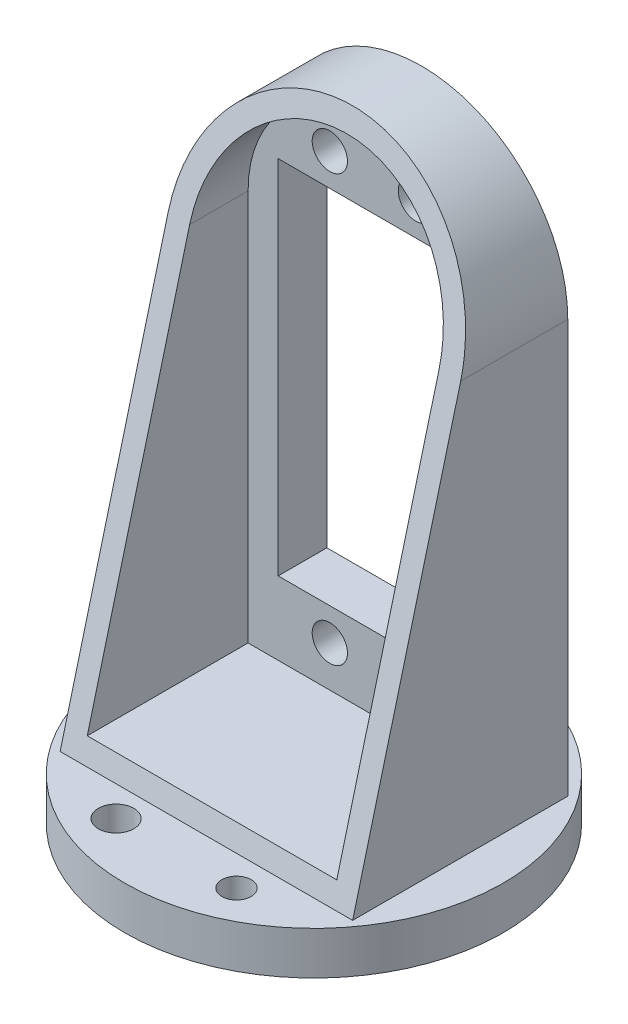
ISO-10303-21;
HEADER;
FILE_DESCRIPTION(('STEP AP214'),'2;1');
FILE_NAME('part.step','',(''),(''),'','','');
FILE_SCHEMA(('AUTOMOTIVE_DESIGN { 1 0 10303 214 1 1 1 1 }'));
ENDSEC;
DATA;
#1=APPLICATION_CONTEXT('core data for automotive mechanical design processes');
#2=APPLICATION_PROTOCOL_DEFINITION('international standard','automotive_design',2000,#1);
#3=PRODUCT_CONTEXT('',#1,'mechanical');
#4=PRODUCT('Part','Part','',(#3));
#5=PRODUCT_RELATED_PRODUCT_CATEGORY('part','',(#4));
#6=PRODUCT_DEFINITION_FORMATION('','',#4);
#7=PRODUCT_DEFINITION_CONTEXT('part definition',#1,'design');
#8=PRODUCT_DEFINITION('design','',#6,#7);
#9=PRODUCT_DEFINITION_SHAPE('','',#8);
#10=(LENGTH_UNIT() NAMED_UNIT(*) SI_UNIT(.MILLI.,.METRE.));
#11=(NAMED_UNIT(*) PLANE_ANGLE_UNIT() SI_UNIT($,.RADIAN.));
#12=(NAMED_UNIT(*) SI_UNIT($,.STERADIAN.) SOLID_ANGLE_UNIT());
#13=UNCERTAINTY_MEASURE_WITH_UNIT(LENGTH_MEASURE(1.E-05),#10,'distance_accuracy_value','');
#14=(GEOMETRIC_REPRESENTATION_CONTEXT(3) GLOBAL_UNCERTAINTY_ASSIGNED_CONTEXT((#13)) GLOBAL_UNIT_ASSIGNED_CONTEXT((#10,
#11,#12)) REPRESENTATION_CONTEXT('',''));
#15=CARTESIAN_POINT('',(0.,0.,0.));
#16=DIRECTION('',(0.,0.,1.));
#17=DIRECTION('',(1.,0.,0.));
#18=AXIS2_PLACEMENT_3D('',#15,#16,#17);
#19=CARTESIAN_POINT('',(0.,5.,0.));
#20=DIRECTION('',(0.,1.,0.));
#21=DIRECTION('',(0.,0.,1.));
#22=AXIS2_PLACEMENT_3D('',#19,#20,#21);
#23=PLANE('',#22);
#24=DIRECTION('',(1.,0.,0.));
#25=VECTOR('',#24,1.);
#26=CARTESIAN_POINT('',(17.,5.,12.5));
#27=LINE('',#26,#25);
#28=CARTESIAN_POINT('',(-17.,5.,12.5));
#29=VERTEX_POINT('',#28);
#30=CARTESIAN_POINT('',(17.,5.,12.5));
#31=VERTEX_POINT('',#30);
#32=EDGE_CURVE('E120',#29,#31,#27,.T.);
#33=ORIENTED_EDGE('',*,*,#32,.F.);
#34=DIRECTION('',(0.,0.,1.));
#35=VECTOR('',#34,1.);
#36=CARTESIAN_POINT('',(-17.,5.,12.5));
#37=LINE('',#36,#35);
#38=CARTESIAN_POINT('',(-17.,5.,-12.5));
#39=VERTEX_POINT('',#38);
#40=EDGE_CURVE('E129',#39,#29,#37,.T.);
#41=ORIENTED_EDGE('',*,*,#40,.F.);
#42=DIRECTION('',(-1.,0.,0.));
#43=VECTOR('',#42,1.);
#44=CARTESIAN_POINT('',(-17.,5.,-12.5));
#45=LINE('',#44,#43);
#46=CARTESIAN_POINT('',(17.,5.,-12.5));
#47=VERTEX_POINT('',#46);
#48=EDGE_CURVE('E141',#47,#39,#45,.T.);
#49=ORIENTED_EDGE('',*,*,#48,.F.);
#50=DIRECTION('',(0.,0.,-1.));
#51=VECTOR('',#50,1.);
#52=CARTESIAN_POINT('',(17.,5.,12.5));
#53=LINE('',#52,#51);
#54=EDGE_CURVE('E128',#31,#47,#53,.T.);
#55=ORIENTED_EDGE('',*,*,#54,.F.);
#56=EDGE_LOOP('',(#33,#41,#49,#55));
#57=FACE_BOUND('',#56,.T.);
#58=CARTESIAN_POINT('',(0.,5.,-17.5));
#59=DIRECTION('',(0.,1.,0.));
#60=DIRECTION('',(0.,0.,1.));
#61=AXIS2_PLACEMENT_3D('',#58,#59,#60);
#62=CIRCLE('',#61,2.05);
#63=CARTESIAN_POINT('',(0.,5.,-15.45));
#64=VERTEX_POINT('',#63);
#65=EDGE_CURVE('E157',#64,#64,#62,.T.);
#66=ORIENTED_EDGE('',*,*,#65,.F.);
#67=EDGE_LOOP('',(#66));
#68=FACE_BOUND('',#67,.T.);
#69=CARTESIAN_POINT('',(-7.,5.,15.999727997688));
#70=DIRECTION('',(0.,1.,0.));
#71=DIRECTION('',(0.,0.,1.));
#72=AXIS2_PLACEMENT_3D('',#69,#70,#71);
#73=CIRCLE('',#72,2.06514369946817);
#74=CARTESIAN_POINT('',(-7.,5.,18.0648716971561));
#75=VERTEX_POINT('',#74);
#76=EDGE_CURVE('E163',#75,#75,#73,.T.);
#77=ORIENTED_EDGE('',*,*,#76,.F.);
#78=EDGE_LOOP('',(#77));
#79=FACE_BOUND('',#78,.T.);
#80=CARTESIAN_POINT('',(7.,5.,15.999727997688));
#81=DIRECTION('',(0.,1.,0.));
#82=DIRECTION('',(0.,0.,1.));
#83=AXIS2_PLACEMENT_3D('',#80,#81,#82);
#84=CIRCLE('',#83,1.70201581916417);
#85=CARTESIAN_POINT('',(7.,5.,17.7017438168521));
#86=VERTEX_POINT('',#85);
#87=EDGE_CURVE('E152',#86,#86,#84,.T.);
#88=ORIENTED_EDGE('',*,*,#87,.F.);
#89=EDGE_LOOP('',(#88));
#90=FACE_BOUND('',#89,.T.);
#91=CARTESIAN_POINT('',(0.,5.,0.));
#92=DIRECTION('',(0.,1.,0.));
#93=DIRECTION('',(0.,0.,1.));
#94=AXIS2_PLACEMENT_3D('',#91,#92,#93);
#95=CIRCLE('',#94,22.);
#96=CARTESIAN_POINT('',(0.,5.,22.));
#97=VERTEX_POINT('',#96);
#98=EDGE_CURVE('E171',#97,#97,#95,.T.);
#99=ORIENTED_EDGE('',*,*,#98,.T.);
#100=EDGE_LOOP('',(#99));
#101=FACE_BOUND('',#100,.T.);
#102=ADVANCED_FACE('F34',(#57,#68,#79,#90,#101),#23,.T.);
#103=CARTESIAN_POINT('',(0.,5.,0.));
#104=DIRECTION('',(0.,-1.,0.));
#105=DIRECTION('',(0.,0.,-1.));
#106=AXIS2_PLACEMENT_3D('',#103,#104,#105);
#107=CYLINDRICAL_SURFACE('',#106,22.);
#108=ORIENTED_EDGE('',*,*,#98,.F.);
#109=EDGE_LOOP('',(#108));
#110=FACE_BOUND('',#109,.T.);
#111=CARTESIAN_POINT('',(0.,0.,0.));
#112=DIRECTION('',(0.,1.,0.));
#113=DIRECTION('',(0.,0.,1.));
#114=AXIS2_PLACEMENT_3D('',#111,#112,#113);
#115=CIRCLE('',#114,22.);
#116=CARTESIAN_POINT('',(0.,0.,22.));
#117=VERTEX_POINT('',#116);
#118=EDGE_CURVE('E156',#117,#117,#115,.T.);
#119=ORIENTED_EDGE('',*,*,#118,.T.);
#120=EDGE_LOOP('',(#119));
#121=FACE_BOUND('',#120,.T.);
#122=ADVANCED_FACE('F36',(#110,#121),#107,.T.);
#123=CARTESIAN_POINT('',(0.,0.,0.));
#124=DIRECTION('',(0.,1.,0.));
#125=DIRECTION('',(0.,0.,1.));
#126=AXIS2_PLACEMENT_3D('',#123,#124,#125);
#127=PLANE('',#126);
#128=CARTESIAN_POINT('',(0.,0.,-17.5));
#129=DIRECTION('',(0.,1.,0.));
#130=DIRECTION('',(0.,0.,1.));
#131=AXIS2_PLACEMENT_3D('',#128,#129,#130);
#132=CIRCLE('',#131,2.05);
#133=CARTESIAN_POINT('',(0.,0.,-15.45));
#134=VERTEX_POINT('',#133);
#135=EDGE_CURVE('E153',#134,#134,#132,.T.);
#136=ORIENTED_EDGE('',*,*,#135,.T.);
#137=EDGE_LOOP('',(#136));
#138=FACE_BOUND('',#137,.T.);
#139=CARTESIAN_POINT('',(-7.,0.,15.999727997688));
#140=DIRECTION('',(0.,1.,0.));
#141=DIRECTION('',(0.,0.,1.));
#142=AXIS2_PLACEMENT_3D('',#139,#140,#141);
#143=CIRCLE('',#142,2.06514369946817);
#144=CARTESIAN_POINT('',(-7.,0.,18.0648716971561));
#145=VERTEX_POINT('',#144);
#146=EDGE_CURVE('E160',#145,#145,#143,.T.);
#147=ORIENTED_EDGE('',*,*,#146,.T.);
#148=EDGE_LOOP('',(#147));
#149=FACE_BOUND('',#148,.T.);
#150=CARTESIAN_POINT('',(7.,0.,15.999727997688));
#151=DIRECTION('',(0.,1.,0.));
#152=DIRECTION('',(0.,0.,1.));
#153=AXIS2_PLACEMENT_3D('',#150,#151,#152);
#154=CIRCLE('',#153,1.70201581916417);
#155=CARTESIAN_POINT('',(7.,0.,17.7017438168521));
#156=VERTEX_POINT('',#155);
#157=EDGE_CURVE('E166',#156,#156,#154,.T.);
#158=ORIENTED_EDGE('',*,*,#157,.T.);
#159=EDGE_LOOP('',(#158));
#160=FACE_BOUND('',#159,.T.);
#161=ORIENTED_EDGE('',*,*,#118,.F.);
#162=EDGE_LOOP('',(#161));
#163=FACE_BOUND('',#162,.T.);
#164=ADVANCED_FACE('F308',(#138,#149,#160,#163),#127,.F.);
#165=CARTESIAN_POINT('',(7.,0.,15.999727997688));
#166=DIRECTION('',(0.,1.,0.));
#167=DIRECTION('',(0.,0.,1.));
#168=AXIS2_PLACEMENT_3D('',#165,#166,#167);
#169=CYLINDRICAL_SURFACE('',#168,1.70201581916417);
#170=ORIENTED_EDGE('',*,*,#157,.F.);
#171=EDGE_LOOP('',(#170));
#172=FACE_BOUND('',#171,.T.);
#173=ORIENTED_EDGE('',*,*,#87,.T.);
#174=EDGE_LOOP('',(#173));
#175=FACE_BOUND('',#174,.T.);
#176=ADVANCED_FACE('F311',(#172,#175),#169,.F.);
#177=CARTESIAN_POINT('',(-7.,0.,15.999727997688));
#178=DIRECTION('',(0.,1.,0.));
#179=DIRECTION('',(0.,0.,1.));
#180=AXIS2_PLACEMENT_3D('',#177,#178,#179);
#181=CYLINDRICAL_SURFACE('',#180,2.06514369946817);
#182=ORIENTED_EDGE('',*,*,#146,.F.);
#183=EDGE_LOOP('',(#182));
#184=FACE_BOUND('',#183,.T.);
#185=ORIENTED_EDGE('',*,*,#76,.T.);
#186=EDGE_LOOP('',(#185));
#187=FACE_BOUND('',#186,.T.);
#188=ADVANCED_FACE('F318',(#184,#187),#181,.F.);
#189=CARTESIAN_POINT('',(0.,0.,-17.5));
#190=DIRECTION('',(0.,1.,0.));
#191=DIRECTION('',(0.,0.,1.));
#192=AXIS2_PLACEMENT_3D('',#189,#190,#191);
#193=CYLINDRICAL_SURFACE('',#192,2.05);
#194=ORIENTED_EDGE('',*,*,#135,.F.);
#195=EDGE_LOOP('',(#194));
#196=FACE_BOUND('',#195,.T.);
#197=ORIENTED_EDGE('',*,*,#65,.T.);
#198=EDGE_LOOP('',(#197));
#199=FACE_BOUND('',#198,.T.);
#200=ADVANCED_FACE('F336',(#196,#199),#193,.F.);
#201=CARTESIAN_POINT('',(-17.,53.,-12.5));
#202=DIRECTION('',(0.,0.,1.));
#203=DIRECTION('',(1.,0.,0.));
#204=AXIS2_PLACEMENT_3D('',#201,#202,#203);
#205=PLANE('',#204);
#206=CARTESIAN_POINT('',(4.99999999999999,61.75,-12.5));
#207=DIRECTION('',(0.,0.,1.));
#208=DIRECTION('',(1.,0.,0.));
#209=AXIS2_PLACEMENT_3D('',#206,#207,#208);
#210=CIRCLE('',#209,2.05);
#211=CARTESIAN_POINT('',(7.04999999999999,61.75,-12.5));
#212=VERTEX_POINT('',#211);
#213=EDGE_CURVE('E234',#212,#212,#210,.T.);
#214=ORIENTED_EDGE('',*,*,#213,.T.);
#215=EDGE_LOOP('',(#214));
#216=FACE_BOUND('',#215,.T.);
#217=CARTESIAN_POINT('',(-5.00000000000001,61.75,-12.5));
#218=DIRECTION('',(0.,0.,1.));
#219=DIRECTION('',(1.,0.,0.));
#220=AXIS2_PLACEMENT_3D('',#217,#218,#219);
#221=CIRCLE('',#220,2.05);
#222=CARTESIAN_POINT('',(-2.95000000000001,61.75,-12.5));
#223=VERTEX_POINT('',#222);
#224=EDGE_CURVE('E231',#223,#223,#221,.T.);
#225=ORIENTED_EDGE('',*,*,#224,.T.);
#226=EDGE_LOOP('',(#225));
#227=FACE_BOUND('',#226,.T.);
#228=DIRECTION('',(1.,0.,0.));
#229=VECTOR('',#228,1.);
#230=CARTESIAN_POINT('',(-17.,16.,-12.5));
#231=LINE('',#230,#229);
#232=CARTESIAN_POINT('',(-11.,16.,-12.5));
#233=VERTEX_POINT('',#232);
#234=CARTESIAN_POINT('',(11.,16.,-12.5));
#235=VERTEX_POINT('',#234);
#236=EDGE_CURVE('E182',#233,#235,#231,.T.);
#237=ORIENTED_EDGE('',*,*,#236,.T.);
#238=DIRECTION('',(0.,1.,0.));
#239=VECTOR('',#238,1.);
#240=CARTESIAN_POINT('',(11.,53.,-12.5));
#241=LINE('',#240,#239);
#242=CARTESIAN_POINT('',(11.,58.,-12.5));
#243=VERTEX_POINT('',#242);
#244=EDGE_CURVE('E42',#235,#243,#241,.T.);
#245=ORIENTED_EDGE('',*,*,#244,.T.);
#246=DIRECTION('',(-1.,0.,0.));
#247=VECTOR('',#246,1.);
#248=CARTESIAN_POINT('',(-17.,58.,-12.5));
#249=LINE('',#248,#247);
#250=CARTESIAN_POINT('',(-11.,58.,-12.5));
#251=VERTEX_POINT('',#250);
#252=EDGE_CURVE('E174',#243,#251,#249,.T.);
#253=ORIENTED_EDGE('',*,*,#252,.T.);
#254=DIRECTION('',(0.,-1.,0.));
#255=VECTOR('',#254,1.);
#256=CARTESIAN_POINT('',(-11.,53.,-12.5));
#257=LINE('',#256,#255);
#258=EDGE_CURVE('E179',#251,#233,#257,.T.);
#259=ORIENTED_EDGE('',*,*,#258,.T.);
#260=EDGE_LOOP('',(#237,#245,#253,#259));
#261=FACE_BOUND('',#260,.T.);
#262=CARTESIAN_POINT('',(5.,12.2506430091094,-12.5));
#263=DIRECTION('',(0.,0.,1.));
#264=DIRECTION('',(1.,0.,0.));
#265=AXIS2_PLACEMENT_3D('',#262,#263,#264);
#266=CIRCLE('',#265,2.0493569908906);
#267=CARTESIAN_POINT('',(7.04935699089061,12.2506430091094,-12.5));
#268=VERTEX_POINT('',#267);
#269=EDGE_CURVE('E228',#268,#268,#266,.T.);
#270=ORIENTED_EDGE('',*,*,#269,.T.);
#271=EDGE_LOOP('',(#270));
#272=FACE_BOUND('',#271,.T.);
#273=CARTESIAN_POINT('',(-5.,12.2506430091094,-12.5));
#274=DIRECTION('',(0.,0.,1.));
#275=DIRECTION('',(1.,0.,0.));
#276=AXIS2_PLACEMENT_3D('',#273,#274,#275);
#277=CIRCLE('',#276,2.0493569908906);
#278=CARTESIAN_POINT('',(-2.9506430091094,12.2506430091094,-12.5));
#279=VERTEX_POINT('',#278);
#280=EDGE_CURVE('E225',#279,#279,#277,.T.);
#281=ORIENTED_EDGE('',*,*,#280,.T.);
#282=EDGE_LOOP('',(#281));
#283=FACE_BOUND('',#282,.T.);
#284=ORIENTED_EDGE('',*,*,#48,.T.);
#285=DIRECTION('',(0.,-1.,0.));
#286=VECTOR('',#285,1.);
#287=CARTESIAN_POINT('',(-17.,53.,-12.5));
#288=LINE('',#287,#286);
#289=CARTESIAN_POINT('',(-17.,53.,-12.5));
#290=VERTEX_POINT('',#289);
#291=EDGE_CURVE('E150',#290,#39,#288,.T.);
#292=ORIENTED_EDGE('',*,*,#291,.F.);
#293=CARTESIAN_POINT('',(0.,53.,-12.5));
#294=DIRECTION('',(0.,0.,-1.));
#295=DIRECTION('',(-1.,0.,0.));
#296=AXIS2_PLACEMENT_3D('',#293,#294,#295);
#297=CIRCLE('',#296,17.);
#298=CARTESIAN_POINT('',(17.,53.,-12.5));
#299=VERTEX_POINT('',#298);
#300=EDGE_CURVE('E252',#290,#299,#297,.T.);
#301=ORIENTED_EDGE('',*,*,#300,.T.);
#302=DIRECTION('',(0.,-1.,0.));
#303=VECTOR('',#302,1.);
#304=CARTESIAN_POINT('',(17.,53.,-12.5));
#305=LINE('',#304,#303);
#306=EDGE_CURVE('E148',#299,#47,#305,.T.);
#307=ORIENTED_EDGE('',*,*,#306,.T.);
#308=EDGE_LOOP('',(#284,#292,#301,#307));
#309=FACE_BOUND('',#308,.T.);
#310=ADVANCED_FACE('F186',(#216,#227,#261,#272,#283,#309),#205,.F.);
#311=CARTESIAN_POINT('',(-17.,53.,12.5));
#312=DIRECTION('',(1.,0.,0.));
#313=DIRECTION('',(0.,0.,-1.));
#314=AXIS2_PLACEMENT_3D('',#311,#312,#313);
#315=PLANE('',#314);
#316=ORIENTED_EDGE('',*,*,#40,.T.);
#317=DIRECTION('',(0.,0.967457923557577,-0.253031946887467));
#318=VECTOR('',#317,1.);
#319=CARTESIAN_POINT('',(-17.,49.9267920250082,0.749707427384973));
#320=LINE('',#319,#318);
#321=CARTESIAN_POINT('',(-17.,53.,-0.0540689210920334));
#322=VERTEX_POINT('',#321);
#323=EDGE_CURVE('E123',#29,#322,#320,.T.);
#324=ORIENTED_EDGE('',*,*,#323,.T.);
#325=DIRECTION('',(0.,0.,1.));
#326=VECTOR('',#325,1.);
#327=CARTESIAN_POINT('',(-17.,53.,12.5));
#328=LINE('',#327,#326);
#329=EDGE_CURVE('E142',#290,#322,#328,.T.);
#330=ORIENTED_EDGE('',*,*,#329,.F.);
#331=ORIENTED_EDGE('',*,*,#291,.T.);
#332=EDGE_LOOP('',(#316,#324,#330,#331));
#333=FACE_BOUND('',#332,.T.);
#334=ADVANCED_FACE('F265',(#333),#315,.F.);
#335=CARTESIAN_POINT('',(17.,53.,12.5));
#336=DIRECTION('',(-1.,0.,0.));
#337=DIRECTION('',(0.,0.,1.));
#338=AXIS2_PLACEMENT_3D('',#335,#336,#337);
#339=PLANE('',#338);
#340=DIRECTION('',(0.,0.,-1.));
#341=VECTOR('',#340,1.);
#342=CARTESIAN_POINT('',(17.,53.,12.5));
#343=LINE('',#342,#341);
#344=CARTESIAN_POINT('',(17.,53.,-0.0540689210920386));
#345=VERTEX_POINT('',#344);
#346=EDGE_CURVE('E136',#345,#299,#343,.T.);
#347=ORIENTED_EDGE('',*,*,#346,.F.);
#348=DIRECTION('',(0.,0.967457923557577,-0.253031946887467));
#349=VECTOR('',#348,1.);
#350=CARTESIAN_POINT('',(17.,3.38009785484681,12.9236742328266));
#351=LINE('',#350,#349);
#352=EDGE_CURVE('E49',#31,#345,#351,.T.);
#353=ORIENTED_EDGE('',*,*,#352,.F.);
#354=ORIENTED_EDGE('',*,*,#54,.T.);
#355=ORIENTED_EDGE('',*,*,#306,.F.);
#356=EDGE_LOOP('',(#347,#353,#354,#355));
#357=FACE_BOUND('',#356,.T.);
#358=ADVANCED_FACE('F133',(#357),#339,.F.);
#359=CARTESIAN_POINT('',(0.,53.,12.5));
#360=DIRECTION('',(0.,0.,-1.));
#361=DIRECTION('',(-1.,0.,0.));
#362=AXIS2_PLACEMENT_3D('',#359,#360,#361);
#363=CYLINDRICAL_SURFACE('',#362,17.);
#364=CARTESIAN_POINT('',(0.,53.,-0.0540689210920351));
#365=DIRECTION('',(0.,-0.253031946887467,-0.967457923557577));
#366=DIRECTION('',(0.,0.967457923557577,-0.253031946887467));
#367=AXIS2_PLACEMENT_3D('',#364,#365,#366);
#368=ELLIPSE('',#367,17.5718236277262,17.);
#369=EDGE_CURVE('E271',#345,#322,#368,.F.);
#370=ORIENTED_EDGE('',*,*,#369,.F.);
#371=ORIENTED_EDGE('',*,*,#346,.T.);
#372=ORIENTED_EDGE('',*,*,#300,.F.);
#373=ORIENTED_EDGE('',*,*,#329,.T.);
#374=EDGE_LOOP('',(#370,#371,#372,#373));
#375=FACE_BOUND('',#374,.T.);
#376=ADVANCED_FACE('F270',(#375),#363,.T.);
#377=CARTESIAN_POINT('',(14.5,0.,-6.846));
#378=DIRECTION('',(1.,0.,0.));
#379=DIRECTION('',(0.,1.,0.));
#380=AXIS2_PLACEMENT_3D('',#377,#378,#379);
#381=PLANE('',#380);
#382=DIRECTION('',(0.,0.,1.));
#383=VECTOR('',#382,1.);
#384=CARTESIAN_POINT('',(14.5,7.5,-6.846));
#385=LINE('',#384,#383);
#386=CARTESIAN_POINT('',(14.5,7.5,-6.846));
#387=VERTEX_POINT('',#386);
#388=CARTESIAN_POINT('',(14.5,7.5,11.8461422436931));
#389=VERTEX_POINT('',#388);
#390=EDGE_CURVE('E249',#387,#389,#385,.T.);
#391=ORIENTED_EDGE('',*,*,#390,.T.);
#392=DIRECTION('',(0.,0.967457923557577,-0.253031946887467));
#393=VECTOR('',#392,1.);
#394=CARTESIAN_POINT('',(14.5,5.05598333301602,12.4853579453934));
#395=LINE('',#394,#393);
#396=CARTESIAN_POINT('',(14.5,53.,-0.0540689210920334));
#397=VERTEX_POINT('',#396);
#398=EDGE_CURVE('E272',#389,#397,#395,.T.);
#399=ORIENTED_EDGE('',*,*,#398,.T.);
#400=DIRECTION('',(0.,0.,1.));
#401=VECTOR('',#400,1.);
#402=CARTESIAN_POINT('',(14.5,53.,-6.846));
#403=LINE('',#402,#401);
#404=CARTESIAN_POINT('',(14.5,53.,-6.846));
#405=VERTEX_POINT('',#404);
#406=EDGE_CURVE('E248',#405,#397,#403,.T.);
#407=ORIENTED_EDGE('',*,*,#406,.F.);
#408=DIRECTION('',(0.,1.,0.));
#409=VECTOR('',#408,1.);
#410=CARTESIAN_POINT('',(14.5,0.,-6.846));
#411=LINE('',#410,#409);
#412=EDGE_CURVE('E237',#387,#405,#411,.T.);
#413=ORIENTED_EDGE('',*,*,#412,.F.);
#414=EDGE_LOOP('',(#391,#399,#407,#413));
#415=FACE_BOUND('',#414,.T.);
#416=ADVANCED_FACE('F354',(#415),#381,.F.);
#417=CARTESIAN_POINT('',(0.,7.5,-6.846));
#418=DIRECTION('',(0.,-1.,0.));
#419=DIRECTION('',(1.,0.,0.));
#420=AXIS2_PLACEMENT_3D('',#417,#418,#419);
#421=PLANE('',#420);
#422=DIRECTION('',(0.,0.,1.));
#423=VECTOR('',#422,1.);
#424=CARTESIAN_POINT('',(-14.5,7.49999999999999,-6.846));
#425=LINE('',#424,#423);
#426=CARTESIAN_POINT('',(-14.5,7.49999999999999,-6.846));
#427=VERTEX_POINT('',#426);
#428=CARTESIAN_POINT('',(-14.5,7.49999999999999,11.8461422436931));
#429=VERTEX_POINT('',#428);
#430=EDGE_CURVE('E253',#427,#429,#425,.T.);
#431=ORIENTED_EDGE('',*,*,#430,.T.);
#432=DIRECTION('',(1.,0.,0.));
#433=VECTOR('',#432,1.);
#434=CARTESIAN_POINT('',(0.,7.5,11.8461422436931));
#435=LINE('',#434,#433);
#436=EDGE_CURVE('E276',#429,#389,#435,.T.);
#437=ORIENTED_EDGE('',*,*,#436,.T.);
#438=ORIENTED_EDGE('',*,*,#390,.F.);
#439=DIRECTION('',(1.,0.,0.));
#440=VECTOR('',#439,1.);
#441=CARTESIAN_POINT('',(0.,7.5,-6.846));
#442=LINE('',#441,#440);
#443=EDGE_CURVE('E245',#427,#387,#442,.T.);
#444=ORIENTED_EDGE('',*,*,#443,.F.);
#445=EDGE_LOOP('',(#431,#437,#438,#444));
#446=FACE_BOUND('',#445,.T.);
#447=ADVANCED_FACE('F357',(#446),#421,.F.);
#448=CARTESIAN_POINT('',(-14.5,0.,-6.846));
#449=DIRECTION('',(1.,0.,0.));
#450=DIRECTION('',(0.,0.,-1.));
#451=AXIS2_PLACEMENT_3D('',#448,#449,#450);
#452=PLANE('',#451);
#453=DIRECTION('',(0.,0.967457923557577,-0.253031946887467));
#454=VECTOR('',#453,1.);
#455=CARTESIAN_POINT('',(-14.5,5.05598333301603,12.4853579453934));
#456=LINE('',#455,#454);
#457=CARTESIAN_POINT('',(-14.5,52.9999999999999,-0.0540689210920047));
#458=VERTEX_POINT('',#457);
#459=EDGE_CURVE('E57',#429,#458,#456,.T.);
#460=ORIENTED_EDGE('',*,*,#459,.F.);
#461=ORIENTED_EDGE('',*,*,#430,.F.);
#462=DIRECTION('',(0.,1.,0.));
#463=VECTOR('',#462,1.);
#464=CARTESIAN_POINT('',(-14.5,0.,-6.846));
#465=LINE('',#464,#463);
#466=CARTESIAN_POINT('',(-14.5,52.9999999999999,-6.846));
#467=VERTEX_POINT('',#466);
#468=EDGE_CURVE('E243',#427,#467,#465,.T.);
#469=ORIENTED_EDGE('',*,*,#468,.T.);
#470=DIRECTION('',(0.,0.,1.));
#471=VECTOR('',#470,1.);
#472=CARTESIAN_POINT('',(-14.5,52.9999999999999,-6.846));
#473=LINE('',#472,#471);
#474=EDGE_CURVE('E256',#467,#458,#473,.T.);
#475=ORIENTED_EDGE('',*,*,#474,.T.);
#476=EDGE_LOOP('',(#460,#461,#469,#475));
#477=FACE_BOUND('',#476,.T.);
#478=ADVANCED_FACE('F362',(#477),#452,.T.);
#479=CARTESIAN_POINT('',(0.,52.9999999999999,-6.846));
#480=DIRECTION('',(0.,0.,1.));
#481=DIRECTION('',(1.,0.,0.));
#482=AXIS2_PLACEMENT_3D('',#479,#480,#481);
#483=CYLINDRICAL_SURFACE('',#482,14.5);
#484=ORIENTED_EDGE('',*,*,#406,.T.);
#485=CARTESIAN_POINT('',(0.,52.9999999999999,-0.0540689210920186));
#486=DIRECTION('',(0.,-0.253031946887467,-0.967457923557577));
#487=DIRECTION('',(0.,-0.967457923557577,0.253031946887467));
#488=AXIS2_PLACEMENT_3D('',#485,#486,#487);
#489=ELLIPSE('',#488,14.9877319177665,14.5);
#490=EDGE_CURVE('E11',#397,#458,#489,.F.);
#491=ORIENTED_EDGE('',*,*,#490,.T.);
#492=ORIENTED_EDGE('',*,*,#474,.F.);
#493=CARTESIAN_POINT('',(0.,52.9999999999999,-6.846));
#494=DIRECTION('',(0.,0.,1.));
#495=DIRECTION('',(1.,0.,0.));
#496=AXIS2_PLACEMENT_3D('',#493,#494,#495);
#497=CIRCLE('',#496,14.5);
#498=EDGE_CURVE('E240',#405,#467,#497,.T.);
#499=ORIENTED_EDGE('',*,*,#498,.F.);
#500=EDGE_LOOP('',(#484,#491,#492,#499));
#501=FACE_BOUND('',#500,.T.);
#502=ADVANCED_FACE('F359',(#501),#483,.F.);
#503=CARTESIAN_POINT('',(0.,0.,-6.846));
#504=DIRECTION('',(0.,0.,1.));
#505=DIRECTION('',(1.,0.,0.));
#506=AXIS2_PLACEMENT_3D('',#503,#504,#505);
#507=PLANE('',#506);
#508=DIRECTION('',(0.,1.,0.));
#509=VECTOR('',#508,1.);
#510=CARTESIAN_POINT('',(11.,16.,-6.846));
#511=LINE('',#510,#509);
#512=CARTESIAN_POINT('',(11.,16.,-6.846));
#513=VERTEX_POINT('',#512);
#514=CARTESIAN_POINT('',(11.,58.,-6.846));
#515=VERTEX_POINT('',#514);
#516=EDGE_CURVE('E219',#513,#515,#511,.T.);
#517=ORIENTED_EDGE('',*,*,#516,.F.);
#518=DIRECTION('',(1.,0.,0.));
#519=VECTOR('',#518,1.);
#520=CARTESIAN_POINT('',(-11.,16.,-6.846));
#521=LINE('',#520,#519);
#522=CARTESIAN_POINT('',(-11.,16.,-6.846));
#523=VERTEX_POINT('',#522);
#524=EDGE_CURVE('E201',#523,#513,#521,.T.);
#525=ORIENTED_EDGE('',*,*,#524,.F.);
#526=DIRECTION('',(0.,-1.,0.));
#527=VECTOR('',#526,1.);
#528=CARTESIAN_POINT('',(-11.,58.,-6.846));
#529=LINE('',#528,#527);
#530=CARTESIAN_POINT('',(-11.,58.,-6.846));
#531=VERTEX_POINT('',#530);
#532=EDGE_CURVE('E283',#531,#523,#529,.T.);
#533=ORIENTED_EDGE('',*,*,#532,.F.);
#534=DIRECTION('',(-1.,0.,0.));
#535=VECTOR('',#534,1.);
#536=CARTESIAN_POINT('',(11.,58.,-6.846));
#537=LINE('',#536,#535);
#538=EDGE_CURVE('E281',#515,#531,#537,.T.);
#539=ORIENTED_EDGE('',*,*,#538,.F.);
#540=EDGE_LOOP('',(#517,#525,#533,#539));
#541=FACE_BOUND('',#540,.T.);
#542=CARTESIAN_POINT('',(4.99999999999999,61.75,-6.846));
#543=DIRECTION('',(0.,0.,1.));
#544=DIRECTION('',(1.,0.,0.));
#545=AXIS2_PLACEMENT_3D('',#542,#543,#544);
#546=CIRCLE('',#545,2.05);
#547=CARTESIAN_POINT('',(7.04999999999999,61.75,-6.846));
#548=VERTEX_POINT('',#547);
#549=EDGE_CURVE('E220',#548,#548,#546,.T.);
#550=ORIENTED_EDGE('',*,*,#549,.F.);
#551=EDGE_LOOP('',(#550));
#552=FACE_BOUND('',#551,.T.);
#553=CARTESIAN_POINT('',(-5.00000000000001,61.75,-6.846));
#554=DIRECTION('',(0.,0.,1.));
#555=DIRECTION('',(1.,0.,0.));
#556=AXIS2_PLACEMENT_3D('',#553,#554,#555);
#557=CIRCLE('',#556,2.05);
#558=CARTESIAN_POINT('',(-2.95000000000001,61.75,-6.846));
#559=VERTEX_POINT('',#558);
#560=EDGE_CURVE('E216',#559,#559,#557,.T.);
#561=ORIENTED_EDGE('',*,*,#560,.F.);
#562=EDGE_LOOP('',(#561));
#563=FACE_BOUND('',#562,.T.);
#564=CARTESIAN_POINT('',(5.,12.2506430091094,-6.846));
#565=DIRECTION('',(0.,0.,1.));
#566=DIRECTION('',(1.,0.,0.));
#567=AXIS2_PLACEMENT_3D('',#564,#565,#566);
#568=CIRCLE('',#567,2.0493569908906);
#569=CARTESIAN_POINT('',(7.04935699089061,12.2506430091094,-6.846));
#570=VERTEX_POINT('',#569);
#571=EDGE_CURVE('E203',#570,#570,#568,.T.);
#572=ORIENTED_EDGE('',*,*,#571,.F.);
#573=EDGE_LOOP('',(#572));
#574=FACE_BOUND('',#573,.T.);
#575=CARTESIAN_POINT('',(-5.,12.2506430091094,-6.846));
#576=DIRECTION('',(0.,0.,1.));
#577=DIRECTION('',(1.,0.,0.));
#578=AXIS2_PLACEMENT_3D('',#575,#576,#577);
#579=CIRCLE('',#578,2.0493569908906);
#580=CARTESIAN_POINT('',(-2.9506430091094,12.2506430091094,-6.846));
#581=VERTEX_POINT('',#580);
#582=EDGE_CURVE('E207',#581,#581,#579,.T.);
#583=ORIENTED_EDGE('',*,*,#582,.F.);
#584=EDGE_LOOP('',(#583));
#585=FACE_BOUND('',#584,.T.);
#586=ORIENTED_EDGE('',*,*,#412,.T.);
#587=ORIENTED_EDGE('',*,*,#498,.T.);
#588=ORIENTED_EDGE('',*,*,#468,.F.);
#589=ORIENTED_EDGE('',*,*,#443,.T.);
#590=EDGE_LOOP('',(#586,#587,#588,#589));
#591=FACE_BOUND('',#590,.T.);
#592=ADVANCED_FACE('F290',(#541,#552,#563,#574,#585,#591),#507,.T.);
#593=CARTESIAN_POINT('',(-5.,12.2506430091094,-26.192));
#594=DIRECTION('',(0.,0.,1.));
#595=DIRECTION('',(1.,0.,0.));
#596=AXIS2_PLACEMENT_3D('',#593,#594,#595);
#597=CYLINDRICAL_SURFACE('',#596,2.0493569908906);
#598=ORIENTED_EDGE('',*,*,#582,.T.);
#599=EDGE_LOOP('',(#598));
#600=FACE_BOUND('',#599,.T.);
#601=ORIENTED_EDGE('',*,*,#280,.F.);
#602=EDGE_LOOP('',(#601));
#603=FACE_BOUND('',#602,.T.);
#604=ADVANCED_FACE('F372',(#600,#603),#597,.F.);
#605=CARTESIAN_POINT('',(5.,12.2506430091094,-26.192));
#606=DIRECTION('',(0.,0.,1.));
#607=DIRECTION('',(1.,0.,0.));
#608=AXIS2_PLACEMENT_3D('',#605,#606,#607);
#609=CYLINDRICAL_SURFACE('',#608,2.0493569908906);
#610=ORIENTED_EDGE('',*,*,#571,.T.);
#611=EDGE_LOOP('',(#610));
#612=FACE_BOUND('',#611,.T.);
#613=ORIENTED_EDGE('',*,*,#269,.F.);
#614=EDGE_LOOP('',(#613));
#615=FACE_BOUND('',#614,.T.);
#616=ADVANCED_FACE('F375',(#612,#615),#609,.F.);
#617=CARTESIAN_POINT('',(-5.00000000000001,61.75,-26.192));
#618=DIRECTION('',(0.,0.,1.));
#619=DIRECTION('',(1.,0.,0.));
#620=AXIS2_PLACEMENT_3D('',#617,#618,#619);
#621=CYLINDRICAL_SURFACE('',#620,2.05);
#622=ORIENTED_EDGE('',*,*,#560,.T.);
#623=EDGE_LOOP('',(#622));
#624=FACE_BOUND('',#623,.T.);
#625=ORIENTED_EDGE('',*,*,#224,.F.);
#626=EDGE_LOOP('',(#625));
#627=FACE_BOUND('',#626,.T.);
#628=ADVANCED_FACE('F380',(#624,#627),#621,.F.);
#629=CARTESIAN_POINT('',(4.99999999999999,61.75,-26.192));
#630=DIRECTION('',(0.,0.,1.));
#631=DIRECTION('',(1.,0.,0.));
#632=AXIS2_PLACEMENT_3D('',#629,#630,#631);
#633=CYLINDRICAL_SURFACE('',#632,2.05);
#634=ORIENTED_EDGE('',*,*,#549,.T.);
#635=EDGE_LOOP('',(#634));
#636=FACE_BOUND('',#635,.T.);
#637=ORIENTED_EDGE('',*,*,#213,.F.);
#638=EDGE_LOOP('',(#637));
#639=FACE_BOUND('',#638,.T.);
#640=ADVANCED_FACE('F377',(#636,#639),#633,.F.);
#641=CARTESIAN_POINT('',(11.,16.,-26.192));
#642=DIRECTION('',(1.,0.,0.));
#643=DIRECTION('',(0.,1.,0.));
#644=AXIS2_PLACEMENT_3D('',#641,#642,#643);
#645=PLANE('',#644);
#646=DIRECTION('',(0.,0.,1.));
#647=VECTOR('',#646,1.);
#648=CARTESIAN_POINT('',(11.,16.,-26.192));
#649=LINE('',#648,#647);
#650=EDGE_CURVE('E193',#235,#513,#649,.T.);
#651=ORIENTED_EDGE('',*,*,#650,.T.);
#652=ORIENTED_EDGE('',*,*,#516,.T.);
#653=DIRECTION('',(0.,0.,1.));
#654=VECTOR('',#653,1.);
#655=CARTESIAN_POINT('',(11.,58.,-26.192));
#656=LINE('',#655,#654);
#657=EDGE_CURVE('E195',#243,#515,#656,.T.);
#658=ORIENTED_EDGE('',*,*,#657,.F.);
#659=ORIENTED_EDGE('',*,*,#244,.F.);
#660=EDGE_LOOP('',(#651,#652,#658,#659));
#661=FACE_BOUND('',#660,.T.);
#662=ADVANCED_FACE('F191',(#661),#645,.F.);
#663=CARTESIAN_POINT('',(-11.,16.,-26.192));
#664=DIRECTION('',(0.,-1.,0.));
#665=DIRECTION('',(1.,0.,0.));
#666=AXIS2_PLACEMENT_3D('',#663,#664,#665);
#667=PLANE('',#666);
#668=DIRECTION('',(0.,0.,1.));
#669=VECTOR('',#668,1.);
#670=CARTESIAN_POINT('',(-11.,16.,-26.192));
#671=LINE('',#670,#669);
#672=EDGE_CURVE('E204',#233,#523,#671,.T.);
#673=ORIENTED_EDGE('',*,*,#672,.T.);
#674=ORIENTED_EDGE('',*,*,#524,.T.);
#675=ORIENTED_EDGE('',*,*,#650,.F.);
#676=ORIENTED_EDGE('',*,*,#236,.F.);
#677=EDGE_LOOP('',(#673,#674,#675,#676));
#678=FACE_BOUND('',#677,.T.);
#679=ADVANCED_FACE('F198',(#678),#667,.F.);
#680=CARTESIAN_POINT('',(-11.,58.,-26.192));
#681=DIRECTION('',(-1.,0.,0.));
#682=DIRECTION('',(0.,-1.,0.));
#683=AXIS2_PLACEMENT_3D('',#680,#681,#682);
#684=PLANE('',#683);
#685=DIRECTION('',(0.,0.,1.));
#686=VECTOR('',#685,1.);
#687=CARTESIAN_POINT('',(-11.,58.,-26.192));
#688=LINE('',#687,#686);
#689=EDGE_CURVE('E209',#251,#531,#688,.T.);
#690=ORIENTED_EDGE('',*,*,#689,.T.);
#691=ORIENTED_EDGE('',*,*,#532,.T.);
#692=ORIENTED_EDGE('',*,*,#672,.F.);
#693=ORIENTED_EDGE('',*,*,#258,.F.);
#694=EDGE_LOOP('',(#690,#691,#692,#693));
#695=FACE_BOUND('',#694,.T.);
#696=ADVANCED_FACE('F286',(#695),#684,.F.);
#697=CARTESIAN_POINT('',(11.,58.,-26.192));
#698=DIRECTION('',(0.,1.,0.));
#699=DIRECTION('',(-1.,0.,0.));
#700=AXIS2_PLACEMENT_3D('',#697,#698,#699);
#701=PLANE('',#700);
#702=ORIENTED_EDGE('',*,*,#657,.T.);
#703=ORIENTED_EDGE('',*,*,#538,.T.);
#704=ORIENTED_EDGE('',*,*,#689,.F.);
#705=ORIENTED_EDGE('',*,*,#252,.F.);
#706=EDGE_LOOP('',(#702,#703,#704,#705));
#707=FACE_BOUND('',#706,.T.);
#708=ADVANCED_FACE('F293',(#707),#701,.F.);
#709=CARTESIAN_POINT('',(-32.346,3.38009785484681,12.9236742328266));
#710=DIRECTION('',(0.,-0.253031946887467,-0.967457923557577));
#711=DIRECTION('',(0.,0.967457923557577,-0.253031946887467));
#712=AXIS2_PLACEMENT_3D('',#709,#710,#711);
#713=PLANE('',#712);
#714=ORIENTED_EDGE('',*,*,#436,.F.);
#715=ORIENTED_EDGE('',*,*,#459,.T.);
#716=ORIENTED_EDGE('',*,*,#490,.F.);
#717=ORIENTED_EDGE('',*,*,#398,.F.);
#718=EDGE_LOOP('',(#714,#715,#716,#717));
#719=FACE_BOUND('',#718,.T.);
#720=ORIENTED_EDGE('',*,*,#32,.T.);
#721=ORIENTED_EDGE('',*,*,#352,.T.);
#722=ORIENTED_EDGE('',*,*,#369,.T.);
#723=ORIENTED_EDGE('',*,*,#323,.F.);
#724=EDGE_LOOP('',(#720,#721,#722,#723));
#725=FACE_BOUND('',#724,.T.);
#726=ADVANCED_FACE('F121',(#719,#725),#713,.F.);
#727=CLOSED_SHELL('',(#102,#122,#164,#176,#188,#200,#310,#334,#358,#376,#416,#447,#478,#502,
#592,#604,#616,#628,#640,#662,#679,#696,#708,#726));
#728=MANIFOLD_SOLID_BREP('B2',#727);
#729=ADVANCED_BREP_SHAPE_REPRESENTATION('',(#18,#728),#14);
#730=SHAPE_DEFINITION_REPRESENTATION(#9,#729);
ENDSEC;
END-ISO-10303-21;
